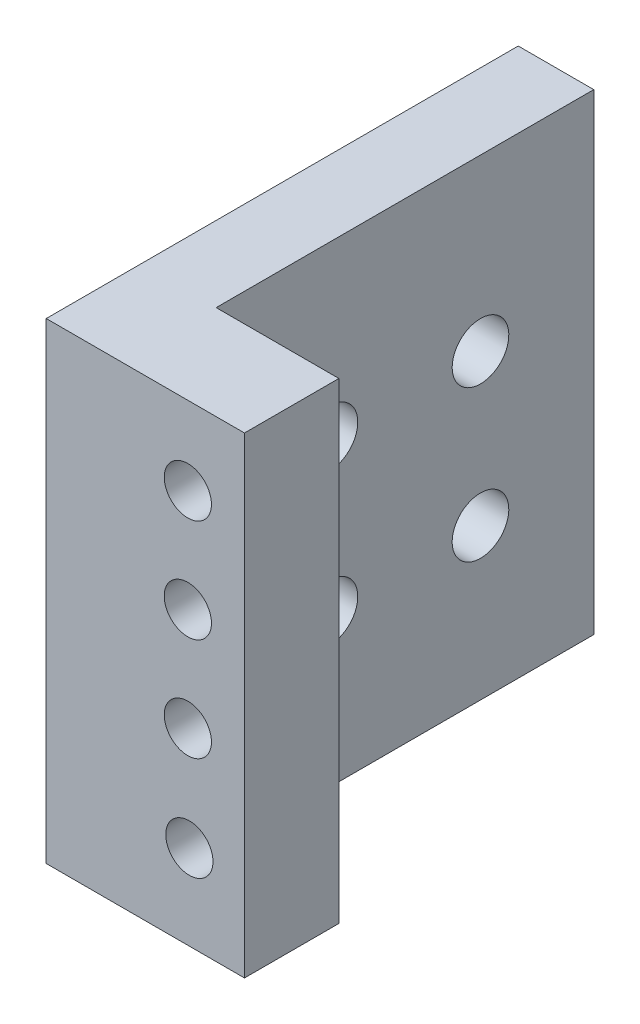
ISO-10303-21;
HEADER;
FILE_DESCRIPTION(('STEP AP214'),'2;1');
FILE_NAME('part.step','',(''),(''),'','','');
FILE_SCHEMA(('AUTOMOTIVE_DESIGN { 1 0 10303 214 1 1 1 1 }'));
ENDSEC;
DATA;
#1=APPLICATION_CONTEXT('core data for automotive mechanical design processes');
#2=APPLICATION_PROTOCOL_DEFINITION('international standard','automotive_design',2000,#1);
#3=PRODUCT_CONTEXT('',#1,'mechanical');
#4=PRODUCT('Part','Part','',(#3));
#5=PRODUCT_RELATED_PRODUCT_CATEGORY('part','',(#4));
#6=PRODUCT_DEFINITION_FORMATION('','',#4);
#7=PRODUCT_DEFINITION_CONTEXT('part definition',#1,'design');
#8=PRODUCT_DEFINITION('design','',#6,#7);
#9=PRODUCT_DEFINITION_SHAPE('','',#8);
#10=(LENGTH_UNIT() NAMED_UNIT(*) SI_UNIT(.MILLI.,.METRE.));
#11=(NAMED_UNIT(*) PLANE_ANGLE_UNIT() SI_UNIT($,.RADIAN.));
#12=(NAMED_UNIT(*) SI_UNIT($,.STERADIAN.) SOLID_ANGLE_UNIT());
#13=UNCERTAINTY_MEASURE_WITH_UNIT(LENGTH_MEASURE(1.E-05),#10,'distance_accuracy_value','');
#14=(GEOMETRIC_REPRESENTATION_CONTEXT(3) GLOBAL_UNCERTAINTY_ASSIGNED_CONTEXT((#13)) GLOBAL_UNIT_ASSIGNED_CONTEXT((#10,
#11,#12)) REPRESENTATION_CONTEXT('',''));
#15=CARTESIAN_POINT('',(0.,0.,0.));
#16=DIRECTION('',(0.,0.,1.));
#17=DIRECTION('',(1.,0.,0.));
#18=AXIS2_PLACEMENT_3D('',#15,#16,#17);
#19=CARTESIAN_POINT('',(0.,0.,5.));
#20=DIRECTION('',(0.,0.,-1.));
#21=DIRECTION('',(-1.,0.,0.));
#22=AXIS2_PLACEMENT_3D('',#19,#20,#21);
#23=PLANE('',#22);
#24=DIRECTION('',(0.,1.,0.));
#25=VECTOR('',#24,1.);
#26=CARTESIAN_POINT('',(2.91884865732705,-12.6118854219113,5.));
#27=LINE('',#26,#25);
#28=CARTESIAN_POINT('',(2.91884865732705,-12.6118854219113,5.));
#29=VERTEX_POINT('',#28);
#30=CARTESIAN_POINT('',(2.91884865732704,12.3881145780887,5.));
#31=VERTEX_POINT('',#30);
#32=EDGE_CURVE('E80',#29,#31,#27,.T.);
#33=ORIENTED_EDGE('',*,*,#32,.T.);
#34=DIRECTION('',(-1.,0.,0.));
#35=VECTOR('',#34,1.);
#36=CARTESIAN_POINT('',(-3.58115134267296,12.3881145780887,5.));
#37=LINE('',#36,#35);
#38=CARTESIAN_POINT('',(-7.58115134267296,12.3881145780887,5.));
#39=VERTEX_POINT('',#38);
#40=EDGE_CURVE('E90',#31,#39,#37,.T.);
#41=ORIENTED_EDGE('',*,*,#40,.T.);
#42=DIRECTION('',(0.,1.,0.));
#43=VECTOR('',#42,1.);
#44=CARTESIAN_POINT('',(-7.58115134267296,12.3881145780887,5.));
#45=LINE('',#44,#43);
#46=CARTESIAN_POINT('',(-7.58115134267296,-12.6118854219113,5.));
#47=VERTEX_POINT('',#46);
#48=EDGE_CURVE('E123',#47,#39,#45,.T.);
#49=ORIENTED_EDGE('',*,*,#48,.F.);
#50=DIRECTION('',(1.,0.,0.));
#51=VECTOR('',#50,1.);
#52=CARTESIAN_POINT('',(-3.58115134267295,-12.6118854219113,5.));
#53=LINE('',#52,#51);
#54=EDGE_CURVE('E58',#47,#29,#53,.T.);
#55=ORIENTED_EDGE('',*,*,#54,.T.);
#56=EDGE_LOOP('',(#33,#41,#49,#55));
#57=FACE_BOUND('',#56,.T.);
#58=CARTESIAN_POINT('',(-0.0811513426729576,8.23752291264459,5.));
#59=DIRECTION('',(0.,0.,1.));
#60=DIRECTION('',(1.,0.,0.));
#61=AXIS2_PLACEMENT_3D('',#58,#59,#60);
#62=CIRCLE('',#61,1.25);
#63=CARTESIAN_POINT('',(1.16884865732704,8.23752291264459,5.));
#64=VERTEX_POINT('',#63);
#65=EDGE_CURVE('E88',#64,#64,#62,.T.);
#66=ORIENTED_EDGE('',*,*,#65,.F.);
#67=EDGE_LOOP('',(#66));
#68=FACE_BOUND('',#67,.T.);
#69=CARTESIAN_POINT('',(-0.0811513426729576,2.78752291264459,5.));
#70=DIRECTION('',(0.,0.,1.));
#71=DIRECTION('',(1.,0.,0.));
#72=AXIS2_PLACEMENT_3D('',#69,#70,#71);
#73=CIRCLE('',#72,1.25);
#74=CARTESIAN_POINT('',(1.16884865732704,2.78752291264459,5.));
#75=VERTEX_POINT('',#74);
#76=EDGE_CURVE('E100',#75,#75,#73,.T.);
#77=ORIENTED_EDGE('',*,*,#76,.F.);
#78=EDGE_LOOP('',(#77));
#79=FACE_BOUND('',#78,.T.);
#80=CARTESIAN_POINT('',(-0.0811513426729576,-2.66247708735541,5.));
#81=DIRECTION('',(0.,0.,1.));
#82=DIRECTION('',(1.,0.,0.));
#83=AXIS2_PLACEMENT_3D('',#80,#81,#82);
#84=CIRCLE('',#83,1.25);
#85=CARTESIAN_POINT('',(1.16884865732704,-2.66247708735541,5.));
#86=VERTEX_POINT('',#85);
#87=EDGE_CURVE('E106',#86,#86,#84,.T.);
#88=ORIENTED_EDGE('',*,*,#87,.F.);
#89=EDGE_LOOP('',(#88));
#90=FACE_BOUND('',#89,.T.);
#91=CARTESIAN_POINT('',(-0.000846901493414845,-8.11188542191127,5.));
#92=DIRECTION('',(0.,0.,1.));
#93=DIRECTION('',(1.,0.,0.));
#94=AXIS2_PLACEMENT_3D('',#91,#92,#93);
#95=CIRCLE('',#94,1.25);
#96=CARTESIAN_POINT('',(1.24915309850659,-8.11188542191127,5.));
#97=VERTEX_POINT('',#96);
#98=EDGE_CURVE('E112',#97,#97,#95,.T.);
#99=ORIENTED_EDGE('',*,*,#98,.F.);
#100=EDGE_LOOP('',(#99));
#101=FACE_BOUND('',#100,.T.);
#102=ADVANCED_FACE('F34',(#57,#68,#79,#90,#101),#23,.F.);
#103=CARTESIAN_POINT('',(0.,0.,0.));
#104=DIRECTION('',(0.,0.,-1.));
#105=DIRECTION('',(-1.,0.,0.));
#106=AXIS2_PLACEMENT_3D('',#103,#104,#105);
#107=PLANE('',#106);
#108=DIRECTION('',(0.,-1.,0.));
#109=VECTOR('',#108,1.);
#110=CARTESIAN_POINT('',(-3.58115134267295,12.3881145780887,0.));
#111=LINE('',#110,#109);
#112=CARTESIAN_POINT('',(-3.58115134267295,12.3881145780887,0.));
#113=VERTEX_POINT('',#112);
#114=CARTESIAN_POINT('',(-3.58115134267296,-12.6118854219113,0.));
#115=VERTEX_POINT('',#114);
#116=EDGE_CURVE('E49',#113,#115,#111,.T.);
#117=ORIENTED_EDGE('',*,*,#116,.F.);
#118=DIRECTION('',(-1.,0.,0.));
#119=VECTOR('',#118,1.);
#120=CARTESIAN_POINT('',(-3.58115134267296,12.3881145780887,0.));
#121=LINE('',#120,#119);
#122=CARTESIAN_POINT('',(2.91884865732704,12.3881145780887,0.));
#123=VERTEX_POINT('',#122);
#124=EDGE_CURVE('E81',#123,#113,#121,.T.);
#125=ORIENTED_EDGE('',*,*,#124,.F.);
#126=DIRECTION('',(0.,1.,0.));
#127=VECTOR('',#126,1.);
#128=CARTESIAN_POINT('',(2.91884865732704,12.3881145780887,0.));
#129=LINE('',#128,#127);
#130=CARTESIAN_POINT('',(2.91884865732705,-12.6118854219113,0.));
#131=VERTEX_POINT('',#130);
#132=EDGE_CURVE('E83',#131,#123,#129,.T.);
#133=ORIENTED_EDGE('',*,*,#132,.F.);
#134=DIRECTION('',(1.,0.,0.));
#135=VECTOR('',#134,1.);
#136=CARTESIAN_POINT('',(-3.58115134267295,-12.6118854219113,0.));
#137=LINE('',#136,#135);
#138=EDGE_CURVE('E70',#115,#131,#137,.T.);
#139=ORIENTED_EDGE('',*,*,#138,.F.);
#140=EDGE_LOOP('',(#117,#125,#133,#139));
#141=FACE_BOUND('',#140,.T.);
#142=CARTESIAN_POINT('',(-0.0811513426729576,-2.66247708735541,0.));
#143=DIRECTION('',(0.,0.,1.));
#144=DIRECTION('',(1.,0.,0.));
#145=AXIS2_PLACEMENT_3D('',#142,#143,#144);
#146=CIRCLE('',#145,1.25);
#147=CARTESIAN_POINT('',(1.16884865732704,-2.66247708735541,0.));
#148=VERTEX_POINT('',#147);
#149=EDGE_CURVE('E109',#148,#148,#146,.T.);
#150=ORIENTED_EDGE('',*,*,#149,.T.);
#151=EDGE_LOOP('',(#150));
#152=FACE_BOUND('',#151,.T.);
#153=CARTESIAN_POINT('',(-0.0811513426729576,8.23752291264459,0.));
#154=DIRECTION('',(0.,0.,1.));
#155=DIRECTION('',(1.,0.,0.));
#156=AXIS2_PLACEMENT_3D('',#153,#154,#155);
#157=CIRCLE('',#156,1.25);
#158=CARTESIAN_POINT('',(1.16884865732704,8.23752291264459,0.));
#159=VERTEX_POINT('',#158);
#160=EDGE_CURVE('E97',#159,#159,#157,.T.);
#161=ORIENTED_EDGE('',*,*,#160,.T.);
#162=EDGE_LOOP('',(#161));
#163=FACE_BOUND('',#162,.T.);
#164=CARTESIAN_POINT('',(-0.0811513426729576,2.78752291264459,0.));
#165=DIRECTION('',(0.,0.,1.));
#166=DIRECTION('',(1.,0.,0.));
#167=AXIS2_PLACEMENT_3D('',#164,#165,#166);
#168=CIRCLE('',#167,1.25);
#169=CARTESIAN_POINT('',(1.16884865732704,2.78752291264459,0.));
#170=VERTEX_POINT('',#169);
#171=EDGE_CURVE('E103',#170,#170,#168,.T.);
#172=ORIENTED_EDGE('',*,*,#171,.T.);
#173=EDGE_LOOP('',(#172));
#174=FACE_BOUND('',#173,.T.);
#175=CARTESIAN_POINT('',(-0.000846901493414845,-8.11188542191127,0.));
#176=DIRECTION('',(0.,0.,1.));
#177=DIRECTION('',(1.,0.,0.));
#178=AXIS2_PLACEMENT_3D('',#175,#176,#177);
#179=CIRCLE('',#178,1.25);
#180=CARTESIAN_POINT('',(1.24915309850659,-8.11188542191127,0.));
#181=VERTEX_POINT('',#180);
#182=EDGE_CURVE('E115',#181,#181,#179,.T.);
#183=ORIENTED_EDGE('',*,*,#182,.T.);
#184=EDGE_LOOP('',(#183));
#185=FACE_BOUND('',#184,.T.);
#186=ADVANCED_FACE('F84',(#141,#152,#163,#174,#185),#107,.T.);
#187=CARTESIAN_POINT('',(2.91884865732704,12.3881145780887,5.));
#188=DIRECTION('',(-1.,0.,0.));
#189=DIRECTION('',(0.,-1.,0.));
#190=AXIS2_PLACEMENT_3D('',#187,#188,#189);
#191=PLANE('',#190);
#192=ORIENTED_EDGE('',*,*,#132,.T.);
#193=DIRECTION('',(0.,0.,-1.));
#194=VECTOR('',#193,1.);
#195=CARTESIAN_POINT('',(2.91884865732704,12.3881145780887,5.));
#196=LINE('',#195,#194);
#197=EDGE_CURVE('E11',#31,#123,#196,.T.);
#198=ORIENTED_EDGE('',*,*,#197,.F.);
#199=ORIENTED_EDGE('',*,*,#32,.F.);
#200=DIRECTION('',(0.,0.,-1.));
#201=VECTOR('',#200,1.);
#202=CARTESIAN_POINT('',(2.91884865732705,-12.6118854219113,5.));
#203=LINE('',#202,#201);
#204=EDGE_CURVE('E42',#29,#131,#203,.T.);
#205=ORIENTED_EDGE('',*,*,#204,.T.);
#206=EDGE_LOOP('',(#192,#198,#199,#205));
#207=FACE_BOUND('',#206,.T.);
#208=ADVANCED_FACE('F36',(#207),#191,.F.);
#209=CARTESIAN_POINT('',(-3.58115134267296,12.3881145780887,5.));
#210=DIRECTION('',(0.,-1.,0.));
#211=DIRECTION('',(0.,0.,-1.));
#212=AXIS2_PLACEMENT_3D('',#209,#210,#211);
#213=PLANE('',#212);
#214=ORIENTED_EDGE('',*,*,#124,.T.);
#215=DIRECTION('',(0.,0.,1.));
#216=VECTOR('',#215,1.);
#217=CARTESIAN_POINT('',(-3.58115134267295,12.3881145780887,-20.));
#218=LINE('',#217,#216);
#219=CARTESIAN_POINT('',(-3.58115134267295,12.3881145780887,-20.));
#220=VERTEX_POINT('',#219);
#221=EDGE_CURVE('E129',#220,#113,#218,.T.);
#222=ORIENTED_EDGE('',*,*,#221,.F.);
#223=DIRECTION('',(-1.,0.,0.));
#224=VECTOR('',#223,1.);
#225=CARTESIAN_POINT('',(-3.58115134267295,12.3881145780887,-20.));
#226=LINE('',#225,#224);
#227=CARTESIAN_POINT('',(-7.58115134267296,12.3881145780887,-20.));
#228=VERTEX_POINT('',#227);
#229=EDGE_CURVE('E139',#220,#228,#226,.T.);
#230=ORIENTED_EDGE('',*,*,#229,.T.);
#231=DIRECTION('',(0.,0.,-1.));
#232=VECTOR('',#231,1.);
#233=CARTESIAN_POINT('',(-7.58115134267296,12.3881145780887,0.));
#234=LINE('',#233,#232);
#235=EDGE_CURVE('E118',#39,#228,#234,.T.);
#236=ORIENTED_EDGE('',*,*,#235,.F.);
#237=ORIENTED_EDGE('',*,*,#40,.F.);
#238=ORIENTED_EDGE('',*,*,#197,.T.);
#239=EDGE_LOOP('',(#214,#222,#230,#236,#237,#238));
#240=FACE_BOUND('',#239,.T.);
#241=ADVANCED_FACE('F199',(#240),#213,.F.);
#242=CARTESIAN_POINT('',(-3.58115134267295,-12.6118854219113,5.));
#243=DIRECTION('',(0.,1.,0.));
#244=DIRECTION('',(0.,0.,1.));
#245=AXIS2_PLACEMENT_3D('',#242,#243,#244);
#246=PLANE('',#245);
#247=DIRECTION('',(0.,0.,1.));
#248=VECTOR('',#247,1.);
#249=CARTESIAN_POINT('',(-7.58115134267296,-12.6118854219113,0.));
#250=LINE('',#249,#248);
#251=CARTESIAN_POINT('',(-7.58115134267296,-12.6118854219113,-20.));
#252=VERTEX_POINT('',#251);
#253=EDGE_CURVE('E126',#252,#47,#250,.T.);
#254=ORIENTED_EDGE('',*,*,#253,.F.);
#255=DIRECTION('',(-1.,0.,0.));
#256=VECTOR('',#255,1.);
#257=CARTESIAN_POINT('',(-3.58115134267296,-12.6118854219113,-20.));
#258=LINE('',#257,#256);
#259=CARTESIAN_POINT('',(-3.58115134267296,-12.6118854219113,-20.));
#260=VERTEX_POINT('',#259);
#261=EDGE_CURVE('E135',#260,#252,#258,.T.);
#262=ORIENTED_EDGE('',*,*,#261,.F.);
#263=DIRECTION('',(0.,0.,1.));
#264=VECTOR('',#263,1.);
#265=CARTESIAN_POINT('',(-3.58115134267296,-12.6118854219113,-20.));
#266=LINE('',#265,#264);
#267=EDGE_CURVE('E79',#260,#115,#266,.T.);
#268=ORIENTED_EDGE('',*,*,#267,.T.);
#269=ORIENTED_EDGE('',*,*,#138,.T.);
#270=ORIENTED_EDGE('',*,*,#204,.F.);
#271=ORIENTED_EDGE('',*,*,#54,.F.);
#272=EDGE_LOOP('',(#254,#262,#268,#269,#270,#271));
#273=FACE_BOUND('',#272,.T.);
#274=ADVANCED_FACE('F73',(#273),#246,.F.);
#275=CARTESIAN_POINT('',(-0.0811513426729576,8.23752291264459,5.));
#276=DIRECTION('',(0.,0.,-1.));
#277=DIRECTION('',(-1.,0.,0.));
#278=AXIS2_PLACEMENT_3D('',#275,#276,#277);
#279=CYLINDRICAL_SURFACE('',#278,1.25);
#280=ORIENTED_EDGE('',*,*,#65,.T.);
#281=EDGE_LOOP('',(#280));
#282=FACE_BOUND('',#281,.T.);
#283=ORIENTED_EDGE('',*,*,#160,.F.);
#284=EDGE_LOOP('',(#283));
#285=FACE_BOUND('',#284,.T.);
#286=ADVANCED_FACE('F219',(#282,#285),#279,.F.);
#287=CARTESIAN_POINT('',(-0.0811513426729576,2.78752291264459,5.));
#288=DIRECTION('',(0.,0.,-1.));
#289=DIRECTION('',(-1.,0.,0.));
#290=AXIS2_PLACEMENT_3D('',#287,#288,#289);
#291=CYLINDRICAL_SURFACE('',#290,1.25);
#292=ORIENTED_EDGE('',*,*,#76,.T.);
#293=EDGE_LOOP('',(#292));
#294=FACE_BOUND('',#293,.T.);
#295=ORIENTED_EDGE('',*,*,#171,.F.);
#296=EDGE_LOOP('',(#295));
#297=FACE_BOUND('',#296,.T.);
#298=ADVANCED_FACE('F335',(#294,#297),#291,.F.);
#299=CARTESIAN_POINT('',(-0.0811513426729576,-2.66247708735541,5.));
#300=DIRECTION('',(0.,0.,-1.));
#301=DIRECTION('',(-1.,0.,0.));
#302=AXIS2_PLACEMENT_3D('',#299,#300,#301);
#303=CYLINDRICAL_SURFACE('',#302,1.25);
#304=ORIENTED_EDGE('',*,*,#87,.T.);
#305=EDGE_LOOP('',(#304));
#306=FACE_BOUND('',#305,.T.);
#307=ORIENTED_EDGE('',*,*,#149,.F.);
#308=EDGE_LOOP('',(#307));
#309=FACE_BOUND('',#308,.T.);
#310=ADVANCED_FACE('F327',(#306,#309),#303,.F.);
#311=CARTESIAN_POINT('',(-0.000846901493414845,-8.11188542191127,5.));
#312=DIRECTION('',(0.,0.,-1.));
#313=DIRECTION('',(-1.,0.,0.));
#314=AXIS2_PLACEMENT_3D('',#311,#312,#313);
#315=CYLINDRICAL_SURFACE('',#314,1.25);
#316=ORIENTED_EDGE('',*,*,#98,.T.);
#317=EDGE_LOOP('',(#316));
#318=FACE_BOUND('',#317,.T.);
#319=ORIENTED_EDGE('',*,*,#182,.F.);
#320=EDGE_LOOP('',(#319));
#321=FACE_BOUND('',#320,.T.);
#322=ADVANCED_FACE('F267',(#318,#321),#315,.F.);
#323=CARTESIAN_POINT('',(-7.58115134267296,0.,0.));
#324=DIRECTION('',(-1.,0.,0.));
#325=DIRECTION('',(0.,0.,1.));
#326=AXIS2_PLACEMENT_3D('',#323,#324,#325);
#327=PLANE('',#326);
#328=CARTESIAN_POINT('',(-7.58115134267295,-4.61188542191126,-6.));
#329=DIRECTION('',(-1.,0.,0.));
#330=DIRECTION('',(0.,0.,1.));
#331=AXIS2_PLACEMENT_3D('',#328,#329,#330);
#332=CIRCLE('',#331,1.5);
#333=CARTESIAN_POINT('',(-7.58115134267295,-4.61188542191126,-4.5));
#334=VERTEX_POINT('',#333);
#335=EDGE_CURVE('E136',#334,#334,#332,.T.);
#336=ORIENTED_EDGE('',*,*,#335,.F.);
#337=EDGE_LOOP('',(#336));
#338=FACE_BOUND('',#337,.T.);
#339=CARTESIAN_POINT('',(-7.58115134267295,-4.61188542191126,-14.));
#340=DIRECTION('',(-1.,0.,0.));
#341=DIRECTION('',(0.,0.,1.));
#342=AXIS2_PLACEMENT_3D('',#339,#340,#341);
#343=CIRCLE('',#342,1.5);
#344=CARTESIAN_POINT('',(-7.58115134267295,-4.61188542191126,-12.5));
#345=VERTEX_POINT('',#344);
#346=EDGE_CURVE('E149',#345,#345,#343,.T.);
#347=ORIENTED_EDGE('',*,*,#346,.F.);
#348=EDGE_LOOP('',(#347));
#349=FACE_BOUND('',#348,.T.);
#350=CARTESIAN_POINT('',(-7.58115134267295,3.38811457808874,-14.));
#351=DIRECTION('',(-1.,0.,0.));
#352=DIRECTION('',(0.,0.,1.));
#353=AXIS2_PLACEMENT_3D('',#350,#351,#352);
#354=CIRCLE('',#353,1.5);
#355=CARTESIAN_POINT('',(-7.58115134267295,3.38811457808874,-12.5));
#356=VERTEX_POINT('',#355);
#357=EDGE_CURVE('E152',#356,#356,#354,.T.);
#358=ORIENTED_EDGE('',*,*,#357,.F.);
#359=EDGE_LOOP('',(#358));
#360=FACE_BOUND('',#359,.T.);
#361=CARTESIAN_POINT('',(-7.58115134267295,3.38811457808874,-6.));
#362=DIRECTION('',(-1.,0.,0.));
#363=DIRECTION('',(0.,0.,1.));
#364=AXIS2_PLACEMENT_3D('',#361,#362,#363);
#365=CIRCLE('',#364,1.5);
#366=CARTESIAN_POINT('',(-7.58115134267295,3.38811457808874,-4.5));
#367=VERTEX_POINT('',#366);
#368=EDGE_CURVE('E155',#367,#367,#365,.T.);
#369=ORIENTED_EDGE('',*,*,#368,.F.);
#370=EDGE_LOOP('',(#369));
#371=FACE_BOUND('',#370,.T.);
#372=ORIENTED_EDGE('',*,*,#235,.T.);
#373=DIRECTION('',(0.,-1.,0.));
#374=VECTOR('',#373,1.);
#375=CARTESIAN_POINT('',(-7.58115134267296,12.3881145780887,-20.));
#376=LINE('',#375,#374);
#377=EDGE_CURVE('E142',#228,#252,#376,.T.);
#378=ORIENTED_EDGE('',*,*,#377,.T.);
#379=ORIENTED_EDGE('',*,*,#253,.T.);
#380=ORIENTED_EDGE('',*,*,#48,.T.);
#381=EDGE_LOOP('',(#372,#378,#379,#380));
#382=FACE_BOUND('',#381,.T.);
#383=ADVANCED_FACE('F177',(#338,#349,#360,#371,#382),#327,.T.);
#384=CARTESIAN_POINT('',(-3.58115134267295,12.3881145780887,-20.));
#385=DIRECTION('',(-1.,0.,0.));
#386=DIRECTION('',(0.,-1.,0.));
#387=AXIS2_PLACEMENT_3D('',#384,#385,#386);
#388=PLANE('',#387);
#389=CARTESIAN_POINT('',(-3.58115134267295,-4.61188542191126,-6.));
#390=DIRECTION('',(1.,0.,0.));
#391=DIRECTION('',(0.,-1.,0.));
#392=AXIS2_PLACEMENT_3D('',#389,#390,#391);
#393=CIRCLE('',#392,1.5);
#394=CARTESIAN_POINT('',(-3.58115134267295,-6.11188542191126,-6.));
#395=VERTEX_POINT('',#394);
#396=EDGE_CURVE('E162',#395,#395,#393,.T.);
#397=ORIENTED_EDGE('',*,*,#396,.F.);
#398=EDGE_LOOP('',(#397));
#399=FACE_BOUND('',#398,.T.);
#400=CARTESIAN_POINT('',(-3.58115134267295,-4.61188542191126,-14.));
#401=DIRECTION('',(1.,0.,0.));
#402=DIRECTION('',(0.,1.,0.));
#403=AXIS2_PLACEMENT_3D('',#400,#401,#402);
#404=CIRCLE('',#403,1.5);
#405=CARTESIAN_POINT('',(-3.58115134267295,-3.11188542191126,-14.));
#406=VERTEX_POINT('',#405);
#407=EDGE_CURVE('E165',#406,#406,#404,.T.);
#408=ORIENTED_EDGE('',*,*,#407,.F.);
#409=EDGE_LOOP('',(#408));
#410=FACE_BOUND('',#409,.T.);
#411=CARTESIAN_POINT('',(-3.58115134267295,3.38811457808874,-14.));
#412=DIRECTION('',(1.,0.,0.));
#413=DIRECTION('',(0.,-1.,0.));
#414=AXIS2_PLACEMENT_3D('',#411,#412,#413);
#415=CIRCLE('',#414,1.5);
#416=CARTESIAN_POINT('',(-3.58115134267295,1.88811457808874,-14.));
#417=VERTEX_POINT('',#416);
#418=EDGE_CURVE('E161',#417,#417,#415,.T.);
#419=ORIENTED_EDGE('',*,*,#418,.F.);
#420=EDGE_LOOP('',(#419));
#421=FACE_BOUND('',#420,.T.);
#422=CARTESIAN_POINT('',(-3.58115134267295,3.38811457808874,-6.));
#423=DIRECTION('',(1.,0.,0.));
#424=DIRECTION('',(0.,1.,0.));
#425=AXIS2_PLACEMENT_3D('',#422,#423,#424);
#426=CIRCLE('',#425,1.5);
#427=CARTESIAN_POINT('',(-3.58115134267295,4.88811457808874,-6.));
#428=VERTEX_POINT('',#427);
#429=EDGE_CURVE('E158',#428,#428,#426,.T.);
#430=ORIENTED_EDGE('',*,*,#429,.F.);
#431=EDGE_LOOP('',(#430));
#432=FACE_BOUND('',#431,.T.);
#433=ORIENTED_EDGE('',*,*,#116,.T.);
#434=ORIENTED_EDGE('',*,*,#267,.F.);
#435=DIRECTION('',(0.,-1.,0.));
#436=VECTOR('',#435,1.);
#437=CARTESIAN_POINT('',(-3.58115134267295,12.3881145780887,-20.));
#438=LINE('',#437,#436);
#439=EDGE_CURVE('E133',#220,#260,#438,.T.);
#440=ORIENTED_EDGE('',*,*,#439,.F.);
#441=ORIENTED_EDGE('',*,*,#221,.T.);
#442=EDGE_LOOP('',(#433,#434,#440,#441));
#443=FACE_BOUND('',#442,.T.);
#444=ADVANCED_FACE('F173',(#399,#410,#421,#432,#443),#388,.F.);
#445=CARTESIAN_POINT('',(0.,0.,-20.));
#446=DIRECTION('',(0.,0.,1.));
#447=DIRECTION('',(1.,0.,0.));
#448=AXIS2_PLACEMENT_3D('',#445,#446,#447);
#449=PLANE('',#448);
#450=ORIENTED_EDGE('',*,*,#261,.T.);
#451=ORIENTED_EDGE('',*,*,#377,.F.);
#452=ORIENTED_EDGE('',*,*,#229,.F.);
#453=ORIENTED_EDGE('',*,*,#439,.T.);
#454=EDGE_LOOP('',(#450,#451,#452,#453));
#455=FACE_BOUND('',#454,.T.);
#456=ADVANCED_FACE('F176',(#455),#449,.F.);
#457=CARTESIAN_POINT('',(-23.581151342673,3.38811457808874,-6.));
#458=DIRECTION('',(1.,0.,0.));
#459=DIRECTION('',(0.,1.,0.));
#460=AXIS2_PLACEMENT_3D('',#457,#458,#459);
#461=CYLINDRICAL_SURFACE('',#460,1.5);
#462=ORIENTED_EDGE('',*,*,#368,.T.);
#463=EDGE_LOOP('',(#462));
#464=FACE_BOUND('',#463,.T.);
#465=ORIENTED_EDGE('',*,*,#429,.T.);
#466=EDGE_LOOP('',(#465));
#467=FACE_BOUND('',#466,.T.);
#468=ADVANCED_FACE('F205',(#464,#467),#461,.F.);
#469=CARTESIAN_POINT('',(-23.581151342673,3.38811457808874,-14.));
#470=DIRECTION('',(1.,0.,0.));
#471=DIRECTION('',(0.,1.,0.));
#472=AXIS2_PLACEMENT_3D('',#469,#470,#471);
#473=CYLINDRICAL_SURFACE('',#472,1.5);
#474=ORIENTED_EDGE('',*,*,#357,.T.);
#475=EDGE_LOOP('',(#474));
#476=FACE_BOUND('',#475,.T.);
#477=ORIENTED_EDGE('',*,*,#418,.T.);
#478=EDGE_LOOP('',(#477));
#479=FACE_BOUND('',#478,.T.);
#480=ADVANCED_FACE('F171',(#476,#479),#473,.F.);
#481=CARTESIAN_POINT('',(-23.581151342673,-4.61188542191126,-14.));
#482=DIRECTION('',(1.,0.,0.));
#483=DIRECTION('',(0.,1.,0.));
#484=AXIS2_PLACEMENT_3D('',#481,#482,#483);
#485=CYLINDRICAL_SURFACE('',#484,1.5);
#486=ORIENTED_EDGE('',*,*,#346,.T.);
#487=EDGE_LOOP('',(#486));
#488=FACE_BOUND('',#487,.T.);
#489=ORIENTED_EDGE('',*,*,#407,.T.);
#490=EDGE_LOOP('',(#489));
#491=FACE_BOUND('',#490,.T.);
#492=ADVANCED_FACE('F288',(#488,#491),#485,.F.);
#493=CARTESIAN_POINT('',(-23.581151342673,-4.61188542191126,-6.));
#494=DIRECTION('',(1.,0.,0.));
#495=DIRECTION('',(0.,1.,0.));
#496=AXIS2_PLACEMENT_3D('',#493,#494,#495);
#497=CYLINDRICAL_SURFACE('',#496,1.5);
#498=ORIENTED_EDGE('',*,*,#335,.T.);
#499=EDGE_LOOP('',(#498));
#500=FACE_BOUND('',#499,.T.);
#501=ORIENTED_EDGE('',*,*,#396,.T.);
#502=EDGE_LOOP('',(#501));
#503=FACE_BOUND('',#502,.T.);
#504=ADVANCED_FACE('F298',(#500,#503),#497,.F.);
#505=CLOSED_SHELL('',(#102,#186,#208,#241,#274,#286,#298,#310,#322,#383,#444,#456,#468,#480,
#492,#504));
#506=MANIFOLD_SOLID_BREP('B2',#505);
#507=ADVANCED_BREP_SHAPE_REPRESENTATION('',(#18,#506),#14);
#508=SHAPE_DEFINITION_REPRESENTATION(#9,#507);
ENDSEC;
END-ISO-10303-21;
